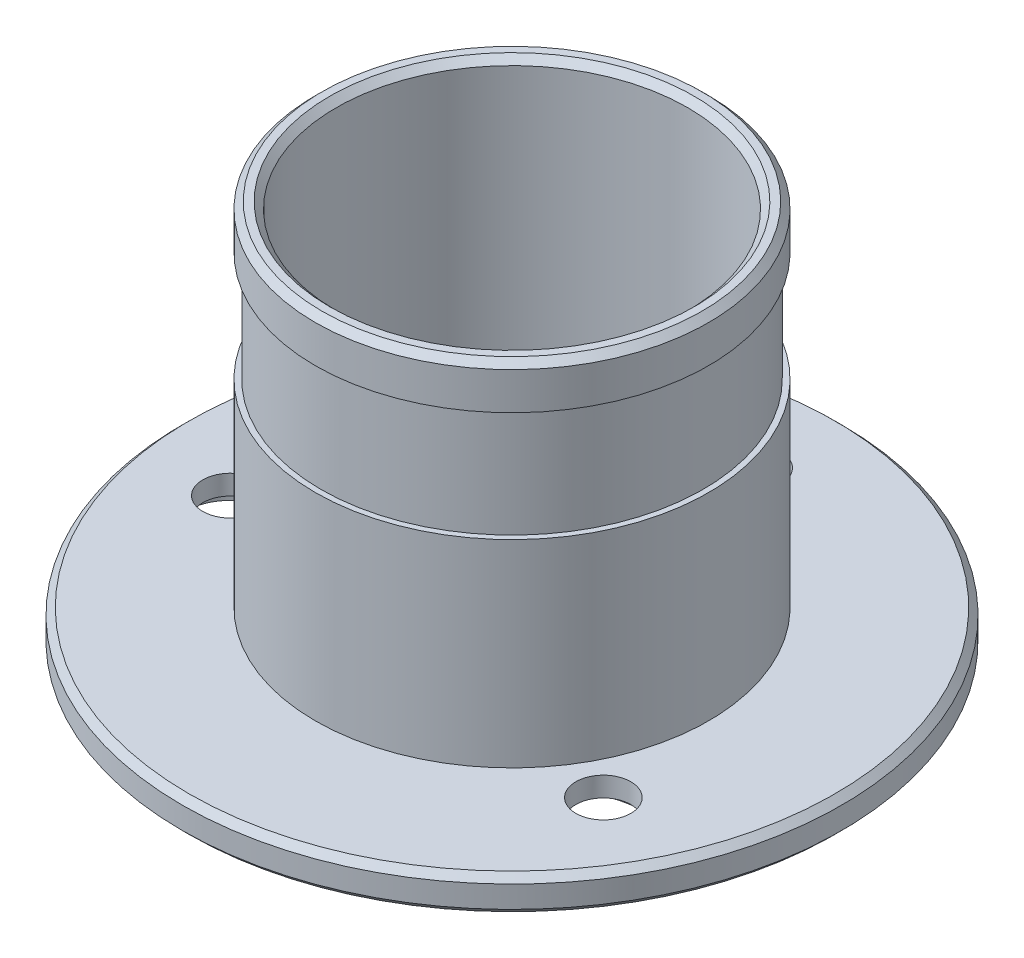
ISO-10303-21;
HEADER;
FILE_DESCRIPTION(('STEP AP214'),'2;1');
FILE_NAME('part.step','',(''),(''),'','','');
FILE_SCHEMA(('AUTOMOTIVE_DESIGN { 1 0 10303 214 1 1 1 1 }'));
ENDSEC;
DATA;
#1=APPLICATION_CONTEXT('core data for automotive mechanical design processes');
#2=APPLICATION_PROTOCOL_DEFINITION('international standard','automotive_design',2000,#1);
#3=PRODUCT_CONTEXT('',#1,'mechanical');
#4=PRODUCT('Part','Part','',(#3));
#5=PRODUCT_RELATED_PRODUCT_CATEGORY('part','',(#4));
#6=PRODUCT_DEFINITION_FORMATION('','',#4);
#7=PRODUCT_DEFINITION_CONTEXT('part definition',#1,'design');
#8=PRODUCT_DEFINITION('design','',#6,#7);
#9=PRODUCT_DEFINITION_SHAPE('','',#8);
#10=(LENGTH_UNIT() NAMED_UNIT(*) SI_UNIT(.MILLI.,.METRE.));
#11=(NAMED_UNIT(*) PLANE_ANGLE_UNIT() SI_UNIT($,.RADIAN.));
#12=(NAMED_UNIT(*) SI_UNIT($,.STERADIAN.) SOLID_ANGLE_UNIT());
#13=UNCERTAINTY_MEASURE_WITH_UNIT(LENGTH_MEASURE(1.E-05),#10,'distance_accuracy_value','');
#14=(GEOMETRIC_REPRESENTATION_CONTEXT(3) GLOBAL_UNCERTAINTY_ASSIGNED_CONTEXT((#13)) GLOBAL_UNIT_ASSIGNED_CONTEXT((#10,
#11,#12)) REPRESENTATION_CONTEXT('',''));
#15=CARTESIAN_POINT('',(0.,0.,0.));
#16=DIRECTION('',(0.,0.,1.));
#17=DIRECTION('',(1.,0.,0.));
#18=AXIS2_PLACEMENT_3D('',#15,#16,#17);
#19=CARTESIAN_POINT('',(0.,17.6,0.));
#20=DIRECTION('',(0.,-1.,0.));
#21=DIRECTION('',(0.,0.,-1.));
#22=AXIS2_PLACEMENT_3D('',#19,#20,#21);
#23=CYLINDRICAL_SURFACE('',#22,8.95);
#24=CARTESIAN_POINT('',(0.,1.6,0.));
#25=DIRECTION('',(0.,1.,0.));
#26=DIRECTION('',(0.,0.,1.));
#27=AXIS2_PLACEMENT_3D('',#24,#25,#26);
#28=CIRCLE('',#27,8.95);
#29=CARTESIAN_POINT('',(0.,1.6,8.95));
#30=VERTEX_POINT('',#29);
#31=EDGE_CURVE('E168',#30,#30,#28,.T.);
#32=ORIENTED_EDGE('',*,*,#31,.T.);
#33=EDGE_LOOP('',(#32));
#34=FACE_BOUND('',#33,.T.);
#35=CARTESIAN_POINT('',(0.,10.6,0.));
#36=DIRECTION('',(0.,1.,0.));
#37=DIRECTION('',(0.,0.,1.));
#38=AXIS2_PLACEMENT_3D('',#35,#36,#37);
#39=CIRCLE('',#38,8.95);
#40=CARTESIAN_POINT('',(0.,10.6,8.95));
#41=VERTEX_POINT('',#40);
#42=EDGE_CURVE('E86',#41,#41,#39,.T.);
#43=ORIENTED_EDGE('',*,*,#42,.F.);
#44=EDGE_LOOP('',(#43));
#45=FACE_BOUND('',#44,.T.);
#46=ADVANCED_FACE('F36',(#34,#45),#23,.T.);
#47=CARTESIAN_POINT('',(-10.8158039832035,1.6,2.00459078041355));
#48=DIRECTION('',(0.,1.,0.));
#49=DIRECTION('',(0.,0.,1.));
#50=AXIS2_PLACEMENT_3D('',#47,#48,#49);
#51=CYLINDRICAL_SURFACE('',#50,1.25);
#52=CARTESIAN_POINT('',(-10.8158039832035,1.6,2.00459078041355));
#53=DIRECTION('',(0.,1.,0.));
#54=DIRECTION('',(0.,0.,1.));
#55=AXIS2_PLACEMENT_3D('',#52,#53,#54);
#56=CIRCLE('',#55,1.24999999999999);
#57=CARTESIAN_POINT('',(-10.8158039832035,1.6,3.25459078041355));
#58=VERTEX_POINT('',#57);
#59=EDGE_CURVE('E197',#58,#58,#56,.T.);
#60=ORIENTED_EDGE('',*,*,#59,.T.);
#61=EDGE_LOOP('',(#60));
#62=FACE_BOUND('',#61,.T.);
#63=CARTESIAN_POINT('',(-10.8158039832035,0.7,2.00459078041355));
#64=DIRECTION('',(0.,-1.,0.));
#65=DIRECTION('',(0.,0.,-1.));
#66=AXIS2_PLACEMENT_3D('',#63,#64,#65);
#67=CIRCLE('',#66,1.25);
#68=CARTESIAN_POINT('',(-10.8158039832035,0.7,0.754590780413557));
#69=VERTEX_POINT('',#68);
#70=EDGE_CURVE('E191',#69,#69,#67,.F.);
#71=ORIENTED_EDGE('',*,*,#70,.F.);
#72=EDGE_LOOP('',(#71));
#73=FACE_BOUND('',#72,.T.);
#74=ADVANCED_FACE('F132',(#62,#73),#51,.F.);
#75=CARTESIAN_POINT('',(9.57391265533893,1.6,5.41665916113808));
#76=DIRECTION('',(0.,1.,0.));
#77=DIRECTION('',(0.,0.,1.));
#78=AXIS2_PLACEMENT_3D('',#75,#76,#77);
#79=CYLINDRICAL_SURFACE('',#78,1.25);
#80=CARTESIAN_POINT('',(9.57391265533893,1.6,5.41665916113808));
#81=DIRECTION('',(0.,1.,0.));
#82=DIRECTION('',(0.,0.,1.));
#83=AXIS2_PLACEMENT_3D('',#80,#81,#82);
#84=CIRCLE('',#83,1.24999999999999);
#85=CARTESIAN_POINT('',(9.57391265533893,1.6,6.66665916113807));
#86=VERTEX_POINT('',#85);
#87=EDGE_CURVE('E194',#86,#86,#84,.T.);
#88=ORIENTED_EDGE('',*,*,#87,.T.);
#89=EDGE_LOOP('',(#88));
#90=FACE_BOUND('',#89,.T.);
#91=CARTESIAN_POINT('',(9.57391265533893,0.7,5.41665916113808));
#92=DIRECTION('',(0.,-1.,0.));
#93=DIRECTION('',(0.,0.,-1.));
#94=AXIS2_PLACEMENT_3D('',#91,#92,#93);
#95=CIRCLE('',#94,1.25);
#96=CARTESIAN_POINT('',(9.57391265533893,0.7,4.16665916113808));
#97=VERTEX_POINT('',#96);
#98=EDGE_CURVE('E110',#97,#97,#95,.F.);
#99=ORIENTED_EDGE('',*,*,#98,.F.);
#100=EDGE_LOOP('',(#99));
#101=FACE_BOUND('',#100,.T.);
#102=ADVANCED_FACE('F128',(#90,#101),#79,.F.);
#103=CARTESIAN_POINT('',(0.,1.6,-11.));
#104=DIRECTION('',(0.,1.,0.));
#105=DIRECTION('',(0.,0.,1.));
#106=AXIS2_PLACEMENT_3D('',#103,#104,#105);
#107=CYLINDRICAL_SURFACE('',#106,1.25);
#108=CARTESIAN_POINT('',(0.,1.6,-11.));
#109=DIRECTION('',(0.,1.,0.));
#110=DIRECTION('',(0.,0.,1.));
#111=AXIS2_PLACEMENT_3D('',#108,#109,#110);
#112=CIRCLE('',#111,1.24999999999999);
#113=CARTESIAN_POINT('',(0.,1.6,-9.75000000000001));
#114=VERTEX_POINT('',#113);
#115=EDGE_CURVE('E101',#114,#114,#112,.T.);
#116=ORIENTED_EDGE('',*,*,#115,.T.);
#117=EDGE_LOOP('',(#116));
#118=FACE_BOUND('',#117,.T.);
#119=CARTESIAN_POINT('',(0.,0.7,-11.));
#120=DIRECTION('',(0.,-1.,0.));
#121=DIRECTION('',(0.,0.,-1.));
#122=AXIS2_PLACEMENT_3D('',#119,#120,#121);
#123=CIRCLE('',#122,1.25);
#124=CARTESIAN_POINT('',(0.,0.7,-12.25));
#125=VERTEX_POINT('',#124);
#126=EDGE_CURVE('E98',#125,#125,#123,.F.);
#127=ORIENTED_EDGE('',*,*,#126,.F.);
#128=EDGE_LOOP('',(#127));
#129=FACE_BOUND('',#128,.T.);
#130=ADVANCED_FACE('F124',(#118,#129),#107,.F.);
#131=CARTESIAN_POINT('',(0.,1.6,0.));
#132=DIRECTION('',(0.,-1.,0.));
#133=DIRECTION('',(0.,0.,-1.));
#134=AXIS2_PLACEMENT_3D('',#131,#132,#133);
#135=CYLINDRICAL_SURFACE('',#134,15.);
#136=CARTESIAN_POINT('',(0.,0.299999999999993,0.));
#137=DIRECTION('',(0.,1.,0.));
#138=DIRECTION('',(0.,0.,1.));
#139=AXIS2_PLACEMENT_3D('',#136,#137,#138);
#140=CIRCLE('',#139,15.);
#141=CARTESIAN_POINT('',(0.,0.299999999999993,15.));
#142=VERTEX_POINT('',#141);
#143=EDGE_CURVE('E406',#142,#142,#140,.T.);
#144=ORIENTED_EDGE('',*,*,#143,.T.);
#145=EDGE_LOOP('',(#144));
#146=FACE_BOUND('',#145,.T.);
#147=CARTESIAN_POINT('',(0.,1.3,0.));
#148=DIRECTION('',(0.,1.,0.));
#149=DIRECTION('',(0.,0.,1.));
#150=AXIS2_PLACEMENT_3D('',#147,#148,#149);
#151=CIRCLE('',#150,15.);
#152=CARTESIAN_POINT('',(0.,1.3,15.));
#153=VERTEX_POINT('',#152);
#154=EDGE_CURVE('E408',#153,#153,#151,.F.);
#155=ORIENTED_EDGE('',*,*,#154,.T.);
#156=EDGE_LOOP('',(#155));
#157=FACE_BOUND('',#156,.T.);
#158=ADVANCED_FACE('F127',(#146,#157),#135,.T.);
#159=CARTESIAN_POINT('',(0.,1.6,0.));
#160=DIRECTION('',(0.,1.,0.));
#161=DIRECTION('',(0.,0.,1.));
#162=AXIS2_PLACEMENT_3D('',#159,#160,#161);
#163=PLANE('',#162);
#164=CARTESIAN_POINT('',(0.,1.6,0.));
#165=DIRECTION('',(0.,1.,0.));
#166=DIRECTION('',(0.,0.,1.));
#167=AXIS2_PLACEMENT_3D('',#164,#165,#166);
#168=CIRCLE('',#167,14.7);
#169=CARTESIAN_POINT('',(0.,1.6,14.7));
#170=VERTEX_POINT('',#169);
#171=EDGE_CURVE('E392',#170,#170,#168,.T.);
#172=ORIENTED_EDGE('',*,*,#171,.T.);
#173=EDGE_LOOP('',(#172));
#174=FACE_BOUND('',#173,.T.);
#175=ORIENTED_EDGE('',*,*,#115,.F.);
#176=EDGE_LOOP('',(#175));
#177=FACE_BOUND('',#176,.T.);
#178=ORIENTED_EDGE('',*,*,#87,.F.);
#179=EDGE_LOOP('',(#178));
#180=FACE_BOUND('',#179,.T.);
#181=ORIENTED_EDGE('',*,*,#59,.F.);
#182=EDGE_LOOP('',(#181));
#183=FACE_BOUND('',#182,.T.);
#184=ORIENTED_EDGE('',*,*,#31,.F.);
#185=EDGE_LOOP('',(#184));
#186=FACE_BOUND('',#185,.T.);
#187=ADVANCED_FACE('F149',(#174,#177,#180,#183,#186),#163,.T.);
#188=CARTESIAN_POINT('',(0.,0.,0.));
#189=DIRECTION('',(0.,1.,0.));
#190=DIRECTION('',(0.,0.,1.));
#191=AXIS2_PLACEMENT_3D('',#188,#189,#190);
#192=PLANE('',#191);
#193=CARTESIAN_POINT('',(0.,0.,0.));
#194=DIRECTION('',(0.,1.,0.));
#195=DIRECTION('',(0.,0.,1.));
#196=AXIS2_PLACEMENT_3D('',#193,#194,#195);
#197=CIRCLE('',#196,14.7);
#198=CARTESIAN_POINT('',(0.,0.,14.7));
#199=VERTEX_POINT('',#198);
#200=EDGE_CURVE('E397',#199,#199,#197,.F.);
#201=ORIENTED_EDGE('',*,*,#200,.T.);
#202=EDGE_LOOP('',(#201));
#203=FACE_BOUND('',#202,.T.);
#204=CARTESIAN_POINT('',(0.,0.,0.));
#205=DIRECTION('',(0.,1.,0.));
#206=DIRECTION('',(0.,0.,1.));
#207=AXIS2_PLACEMENT_3D('',#204,#205,#206);
#208=CIRCLE('',#207,10.);
#209=CARTESIAN_POINT('',(-1.64580609002106,0.,-9.86363636363636));
#210=VERTEX_POINT('',#209);
#211=CARTESIAN_POINT('',(-9.9983931986449,0.,0.179258041078813));
#212=VERTEX_POINT('',#211);
#213=EDGE_CURVE('E92',#210,#212,#208,.T.);
#214=ORIENTED_EDGE('',*,*,#213,.T.);
#215=CARTESIAN_POINT('',(-10.8158039832035,0.,2.00459078041355));
#216=DIRECTION('',(0.,-1.,0.));
#217=DIRECTION('',(0.,0.,-1.));
#218=AXIS2_PLACEMENT_3D('',#215,#216,#217);
#219=CIRCLE('',#218,2.);
#220=CARTESIAN_POINT('',(-9.39854452329859,0.,3.41575187090252));
#221=VERTEX_POINT('',#220);
#222=EDGE_CURVE('E50',#221,#212,#219,.T.);
#223=ORIENTED_EDGE('',*,*,#222,.F.);
#224=CARTESIAN_POINT('',(7.77443839768273,0.,6.28952363861019));
#225=VERTEX_POINT('',#224);
#226=EDGE_CURVE('E84',#221,#225,#208,.T.);
#227=ORIENTED_EDGE('',*,*,#226,.T.);
#228=CARTESIAN_POINT('',(9.57391265533893,0.,5.41665916113808));
#229=DIRECTION('',(0.,-1.,0.));
#230=DIRECTION('',(0.,0.,-1.));
#231=AXIS2_PLACEMENT_3D('',#228,#229,#230);
#232=CIRCLE('',#231,2.);
#233=CARTESIAN_POINT('',(9.39530578585899,0.,3.42465022888537));
#234=VERTEX_POINT('',#233);
#235=EDGE_CURVE('E57',#234,#225,#232,.T.);
#236=ORIENTED_EDGE('',*,*,#235,.F.);
#237=CARTESIAN_POINT('',(1.64580609002106,0.,-9.86363636363637));
#238=VERTEX_POINT('',#237);
#239=EDGE_CURVE('E82',#234,#238,#208,.T.);
#240=ORIENTED_EDGE('',*,*,#239,.T.);
#241=CARTESIAN_POINT('',(0.,0.,-11.));
#242=DIRECTION('',(0.,-1.,0.));
#243=DIRECTION('',(0.,0.,-1.));
#244=AXIS2_PLACEMENT_3D('',#241,#242,#243);
#245=CIRCLE('',#244,2.);
#246=EDGE_CURVE('E189',#210,#238,#245,.T.);
#247=ORIENTED_EDGE('',*,*,#246,.F.);
#248=EDGE_LOOP('',(#214,#223,#227,#236,#240,#247));
#249=FACE_BOUND('',#248,.T.);
#250=ADVANCED_FACE('F80',(#203,#249),#192,.F.);
#251=CARTESIAN_POINT('',(0.,17.3,0.));
#252=DIRECTION('',(0.,1.,0.));
#253=DIRECTION('',(0.,0.,1.));
#254=AXIS2_PLACEMENT_3D('',#251,#252,#253);
#255=CIRCLE('',#254,8.95);
#256=CARTESIAN_POINT('',(0.,17.3,8.95));
#257=VERTEX_POINT('',#256);
#258=EDGE_CURVE('E11',#257,#257,#255,.F.);
#259=ORIENTED_EDGE('',*,*,#258,.T.);
#260=EDGE_LOOP('',(#259));
#261=FACE_BOUND('',#260,.T.);
#262=CARTESIAN_POINT('',(0.,15.6,0.));
#263=DIRECTION('',(0.,1.,0.));
#264=DIRECTION('',(0.,0.,1.));
#265=AXIS2_PLACEMENT_3D('',#262,#263,#264);
#266=CIRCLE('',#265,8.95);
#267=CARTESIAN_POINT('',(0.,15.6,8.95));
#268=VERTEX_POINT('',#267);
#269=EDGE_CURVE('E172',#268,#268,#266,.T.);
#270=ORIENTED_EDGE('',*,*,#269,.T.);
#271=EDGE_LOOP('',(#270));
#272=FACE_BOUND('',#271,.T.);
#273=ADVANCED_FACE('F144',(#261,#272),#23,.T.);
#274=CARTESIAN_POINT('',(0.,17.6,0.));
#275=DIRECTION('',(0.,1.,0.));
#276=DIRECTION('',(0.,0.,1.));
#277=AXIS2_PLACEMENT_3D('',#274,#275,#276);
#278=PLANE('',#277);
#279=CARTESIAN_POINT('',(0.,17.6,0.));
#280=DIRECTION('',(0.,1.,0.));
#281=DIRECTION('',(0.,0.,1.));
#282=AXIS2_PLACEMENT_3D('',#279,#280,#281);
#283=CIRCLE('',#282,8.3);
#284=CARTESIAN_POINT('',(0.,17.6,8.3));
#285=VERTEX_POINT('',#284);
#286=EDGE_CURVE('E391',#285,#285,#283,.F.);
#287=ORIENTED_EDGE('',*,*,#286,.T.);
#288=EDGE_LOOP('',(#287));
#289=FACE_BOUND('',#288,.T.);
#290=CARTESIAN_POINT('',(0.,17.6,0.));
#291=DIRECTION('',(0.,1.,0.));
#292=DIRECTION('',(0.,0.,1.));
#293=AXIS2_PLACEMENT_3D('',#290,#291,#292);
#294=CIRCLE('',#293,8.65);
#295=CARTESIAN_POINT('',(0.,17.6,8.65));
#296=VERTEX_POINT('',#295);
#297=EDGE_CURVE('E389',#296,#296,#294,.T.);
#298=ORIENTED_EDGE('',*,*,#297,.T.);
#299=EDGE_LOOP('',(#298));
#300=FACE_BOUND('',#299,.T.);
#301=ADVANCED_FACE('F140',(#289,#300),#278,.T.);
#302=CARTESIAN_POINT('',(0.,17.6,0.));
#303=DIRECTION('',(0.,-1.,0.));
#304=DIRECTION('',(0.,0.,-1.));
#305=AXIS2_PLACEMENT_3D('',#302,#303,#304);
#306=CYLINDRICAL_SURFACE('',#305,8.);
#307=CARTESIAN_POINT('',(0.,17.3,0.));
#308=DIRECTION('',(0.,1.,0.));
#309=DIRECTION('',(0.,0.,1.));
#310=AXIS2_PLACEMENT_3D('',#307,#308,#309);
#311=CIRCLE('',#310,8.);
#312=CARTESIAN_POINT('',(0.,17.3,8.));
#313=VERTEX_POINT('',#312);
#314=EDGE_CURVE('E44',#313,#313,#311,.T.);
#315=ORIENTED_EDGE('',*,*,#314,.T.);
#316=EDGE_LOOP('',(#315));
#317=FACE_BOUND('',#316,.T.);
#318=CARTESIAN_POINT('',(0.,2.,0.));
#319=DIRECTION('',(0.,1.,0.));
#320=DIRECTION('',(0.,0.,1.));
#321=AXIS2_PLACEMENT_3D('',#318,#319,#320);
#322=CIRCLE('',#321,8.);
#323=CARTESIAN_POINT('',(0.,2.,8.));
#324=VERTEX_POINT('',#323);
#325=EDGE_CURVE('E94',#324,#324,#322,.F.);
#326=ORIENTED_EDGE('',*,*,#325,.T.);
#327=EDGE_LOOP('',(#326));
#328=FACE_BOUND('',#327,.T.);
#329=ADVANCED_FACE('F137',(#317,#328),#306,.F.);
#330=CARTESIAN_POINT('',(0.,2.,0.));
#331=DIRECTION('',(0.,1.,0.));
#332=DIRECTION('',(0.,0.,1.));
#333=AXIS2_PLACEMENT_3D('',#330,#331,#332);
#334=TOROIDAL_SURFACE('',#333,10.,2.);
#335=CARTESIAN_POINT('',(-10.0002,8.02871343814136E-07,0.178450002000629));
#336=CARTESIAN_POINT('',(-9.95175655283306,-5.41635682755072E-05,0.200073787911794));
#337=CARTESIAN_POINT('',(-9.90421512538996,0.00164634955110516,0.223630471712747));
#338=CARTESIAN_POINT('',(-9.81136999973981,0.00803475739235196,0.274303943456465));
#339=CARTESIAN_POINT('',(-9.76606289711438,0.0127179457406307,0.301415069407518));
#340=CARTESIAN_POINT('',(-9.67829235556666,0.0245072981426061,0.358747880782084));
#341=CARTESIAN_POINT('',(-9.63581030294693,0.0315952165107423,0.388944980012131));
#342=CARTESIAN_POINT('',(-9.55354093988836,0.0476401050901379,0.452369459736765));
#343=CARTESIAN_POINT('',(-9.51375469154369,0.056597806352712,0.485598022609756));
#344=CARTESIAN_POINT('',(-9.39915583762231,0.0853022481486939,0.5890837160956));
#345=CARTESIAN_POINT('',(-9.32853684992701,0.106970488670622,0.663513800750266));
#346=CARTESIAN_POINT('',(-9.19932458007804,0.150780685193722,0.822424299656711));
#347=CARTESIAN_POINT('',(-9.14076861636084,0.172923883994918,0.906934662009231));
#348=CARTESIAN_POINT('',(-9.0598294027629,0.20391401916117,1.04549478597275));
#349=CARTESIAN_POINT('',(-9.03287498916442,0.214321004054683,1.09656202457442));
#350=CARTESIAN_POINT('',(-8.98335970854738,0.23288219942919,1.20116514566655));
#351=CARTESIAN_POINT('',(-8.96079645136246,0.241037636476084,1.25469966544367));
#352=CARTESIAN_POINT('',(-8.92037900692208,0.254348994446374,1.36370655941676));
#353=CARTESIAN_POINT('',(-8.9025112301413,0.259513624686197,1.41917280316776));
#354=CARTESIAN_POINT('',(-8.87165203582803,0.266372569324552,1.53165135860577));
#355=CARTESIAN_POINT('',(-8.85865939267074,0.268067756430638,1.58866327783496));
#356=CARTESIAN_POINT('',(-8.83925702111371,0.267835825520736,1.69516051663332));
#357=CARTESIAN_POINT('',(-8.8321613170127,0.266403477179875,1.74452345482672));
#358=CARTESIAN_POINT('',(-8.82167915896617,0.261007279479681,1.84350992016796));
#359=CARTESIAN_POINT('',(-8.81829397786852,0.257042562160975,1.89313353087446));
#360=CARTESIAN_POINT('',(-8.81369504472958,0.241729876948254,2.04191339173264));
#361=CARTESIAN_POINT('',(-8.81804503465611,0.226963813813461,2.14093899957294));
#362=CARTESIAN_POINT('',(-8.84074227402581,0.192452980809001,2.33375355859857));
#363=CARTESIAN_POINT('',(-8.85873828735643,0.17284133878384,2.42761150582449));
#364=CARTESIAN_POINT('',(-8.90777955545328,0.132430771377901,2.61165663481893));
#365=CARTESIAN_POINT('',(-8.9388387500397,0.111630598256645,2.70183978208429));
#366=CARTESIAN_POINT('',(-9.0211878196832,0.0689002348758596,2.89473831723904));
#367=CARTESIAN_POINT('',(-9.07525068034403,0.0475484429214441,2.99644287685761));
#368=CARTESIAN_POINT('',(-9.16941518456613,0.0232291268322022,3.14157471263807));
#369=CARTESIAN_POINT('',(-9.202960903903,0.0164089619499197,3.18869193499434));
#370=CARTESIAN_POINT('',(-9.27419678477926,0.00604431815246742,3.28005126312658));
#371=CARTESIAN_POINT('',(-9.31188480684799,0.00249815705129509,3.324294834511));
#372=CARTESIAN_POINT('',(-9.4081920740971,-0.00132294969571857,3.42780618161867));
#373=CARTESIAN_POINT('',(-9.46882573506844,0.000474005248986617,3.48531871318394));
#374=CARTESIAN_POINT('',(-9.59616693090646,0.0136779614062133,3.59184034481225));
#375=CARTESIAN_POINT('',(-9.66286812140527,0.0250750252194257,3.6408581747913));
#376=CARTESIAN_POINT('',(-9.77514964062881,0.0521402564352119,3.71332219199655));
#377=CARTESIAN_POINT('',(-9.81966551202949,0.0647828866737897,3.73961295212852));
#378=CARTESIAN_POINT('',(-9.9094966711039,0.09420553440937,3.78819050318382));
#379=CARTESIAN_POINT('',(-9.95481180223008,0.110984749865956,3.81047806883819));
#380=CARTESIAN_POINT('',(-10.0002,0.12981405041566,3.83073155882648));
#381=B_SPLINE_CURVE_WITH_KNOTS('',3,(#335,#336,#337,#338,#339,#340,#341,#342,#343,#344,#345,
#346,#347,#348,#349,#350,#351,#352,#353,#354,#355,#356,#357,#358,#359,#360,#361,#362,#363,#364,
#365,#366,#367,#368,#369,#370,#371,#372,#373,#374,#375,#376,#377,#378,#379,#380),.UNSPECIFIED.,
.F.,.F.,(4,2,2,2,2,2,2,2,2,2,2,2,2,2,2,2,2,2,2,2,2,2,4),(0.,0.15902588495227,0.317801461994482,
0.475398327605014,0.633056926546343,0.946346672115495,1.26059152639378,1.43639719608472,
1.61210690305319,1.78730233133886,1.96245368535432,2.11191821336749,2.26143399726154,
2.56058478019611,2.85228655471634,3.14430039936457,3.4935831299027,3.6680433018592,
3.84241378606119,4.09202798199913,4.34138411086534,4.50075475840182,4.66009452991284),.UNSPECIFIED.);
#382=EDGE_CURVE('E75',#212,#221,#381,.T.);
#383=ORIENTED_EDGE('',*,*,#382,.F.);
#384=ORIENTED_EDGE('',*,*,#213,.F.);
#385=CARTESIAN_POINT('',(1.73216626222773,0.00556606918945767,-10.0002));
#386=CARTESIAN_POINT('',(1.70705596950393,0.00202547902098039,-9.95666918010905));
#387=CARTESIAN_POINT('',(1.68023472544801,0.000240492864602129,-9.91401576926436));
#388=CARTESIAN_POINT('',(1.62348730807238,-0.000193482640913605,-9.83089647789337));
#389=CARTESIAN_POINT('',(1.59356572665659,0.00115295174974964,-9.79042749349801));
#390=CARTESIAN_POINT('',(1.53117024449527,0.00657148944891971,-9.71236901491026));
#391=CARTESIAN_POINT('',(1.49872456460112,0.0106164589265417,-9.67475496673333));
#392=CARTESIAN_POINT('',(1.43129975810537,0.0209631778310298,-9.60220308170686));
#393=CARTESIAN_POINT('',(1.39631978187626,0.0272656869212178,-9.56726615051837));
#394=CARTESIAN_POINT('',(1.28836169550636,0.0487861018140975,-9.46712377018182));
#395=CARTESIAN_POINT('',(1.21197315244876,0.066661828280697,-9.40609934637752));
#396=CARTESIAN_POINT('',(1.05153434691127,0.105680640496303,-9.29594155618274));
#397=CARTESIAN_POINT('',(0.967455991541167,0.126835920087793,-9.24685439906336));
#398=CARTESIAN_POINT('',(0.78051526591556,0.171182954797858,-9.1552609191298));
#399=CARTESIAN_POINT('',(0.676672056572742,0.194244368519742,-9.11464222546955));
#400=CARTESIAN_POINT('',(0.516186004760411,0.223264757654924,-9.06695426712702));
#401=CARTESIAN_POINT('',(0.461941200482462,0.232005656900522,-9.05326964349725));
#402=CARTESIAN_POINT('',(0.352171834866163,0.246950902891493,-9.03045406736736));
#403=CARTESIAN_POINT('',(0.296648161593543,0.253156956921107,-9.02132004900195));
#404=CARTESIAN_POINT('',(0.187187360458964,0.262283670183095,-9.00804913751075));
#405=CARTESIAN_POINT('',(0.133285264281589,0.265334633612435,-9.00371348046536));
#406=CARTESIAN_POINT('',(0.0252191720402137,0.268349887028038,-8.99942821034744));
#407=CARTESIAN_POINT('',(-0.0289448138556509,0.268314295905794,-8.99947842833467));
#408=CARTESIAN_POINT('',(-0.137015089464536,0.265157295560541,-9.00396589076748));
#409=CARTESIAN_POINT('',(-0.190921300076879,0.262034993443095,-9.00840440461763));
#410=CARTESIAN_POINT('',(-0.297950223943025,0.252981109905922,-9.02158241742881));
#411=CARTESIAN_POINT('',(-0.351072926111271,0.247049488777471,-9.03032197718367));
#412=CARTESIAN_POINT('',(-0.49444889748858,0.227663382099338,-9.05986819149799));
#413=CARTESIAN_POINT('',(-0.583557874242318,0.211876502778277,-9.08482751595515));
#414=CARTESIAN_POINT('',(-0.756884112682924,0.176571881436012,-9.14645713730162));
#415=CARTESIAN_POINT('',(-0.841093804133856,0.15704855567661,-9.18314501703676));
#416=CARTESIAN_POINT('',(-1.01888390431818,0.114158811480118,-9.27555945192192));
#417=CARTESIAN_POINT('',(-1.11128460778061,0.090754462695571,-9.3335602298065));
#418=CARTESIAN_POINT('',(-1.2859980898944,0.0494607995166572,-9.46440355091746));
#419=CARTESIAN_POINT('',(-1.36834147691581,0.0315544871260843,-9.53719916966554));
#420=CARTESIAN_POINT('',(-1.49951123879346,0.0100169702751413,-9.67418718851571));
#421=CARTESIAN_POINT('',(-1.55128669967205,0.00379946822819745,-9.73513285210472));
#422=CARTESIAN_POINT('',(-1.62341260261407,6.08186531655146E-07,-9.83117550643299));
#423=CARTESIAN_POINT('',(-1.6465936198189,-0.000336969473546896,-9.86406749238547));
#424=CARTESIAN_POINT('',(-1.69093434855289,0.00103341263054042,-9.93118602170716));
#425=CARTESIAN_POINT('',(-1.71209224743963,0.00274318854627713,-9.96541372388238));
#426=CARTESIAN_POINT('',(-1.73216626222773,0.00556606918945779,-10.0002));
#427=B_SPLINE_CURVE_WITH_KNOTS('',3,(#385,#386,#387,#388,#389,#390,#391,#392,#393,#394,#395,
#396,#397,#398,#399,#400,#401,#402,#403,#404,#405,#406,#407,#408,#409,#410,#411,#412,#413,#414,
#415,#416,#417,#418,#419,#420,#421,#422,#423,#424,#425,#426),.UNSPECIFIED.,.F.,.F.,(4,2,2,2,2,2,
2,2,2,2,2,2,2,2,2,2,2,2,2,2,4),(0.,0.151027292620313,0.301834012564506,0.451146773716796,
0.600509825968807,0.897377453023306,1.19537659035296,1.53515721428152,1.704823332178,
1.87437498633731,2.03660465300063,2.19882807071599,2.36109842861574,2.52337108021767,
2.80386355630666,3.0847785198742,3.41806297890693,3.75030641617098,3.99005604227586,
4.11066620540493,4.23138343782949),.UNSPECIFIED.);
#428=EDGE_CURVE('E76',#238,#210,#427,.T.);
#429=ORIENTED_EDGE('',*,*,#428,.F.);
#430=ORIENTED_EDGE('',*,*,#239,.F.);
#431=CARTESIAN_POINT('',(8.909380197824,0.7002,7.30303044296708));
#432=CARTESIAN_POINT('',(8.84754678218232,0.628092539337089,7.28129675955265));
#433=CARTESIAN_POINT('',(8.78231397104917,0.560020454916646,7.25484934763422));
#434=CARTESIAN_POINT('',(8.64747986785416,0.433029218268382,7.19072139219902));
#435=CARTESIAN_POINT('',(8.577847691096,0.37418799066388,7.15295231271843));
#436=CARTESIAN_POINT('',(8.43734746781996,0.267657854792765,7.06442995850649));
#437=CARTESIAN_POINT('',(8.36647471941458,0.220032340859535,7.01360611860893));
#438=CARTESIAN_POINT('',(8.22806587507016,0.13834874914769,6.89879283346476));
#439=CARTESIAN_POINT('',(8.16051722826784,0.104235549027094,6.83485852715946));
#440=CARTESIAN_POINT('',(8.03984026013041,0.0534159790745295,6.70263120169964));
#441=CARTESIAN_POINT('',(7.98594386389388,0.0351927035482615,6.63561930739283));
#442=CARTESIAN_POINT('',(7.88646456961135,0.00988859910048022,6.49370517311384));
#443=CARTESIAN_POINT('',(7.84088834970223,0.002816686282486,6.41879667038296));
#444=CARTESIAN_POINT('',(7.76254045337692,-0.00129143679353432,6.26851286052434));
#445=CARTESIAN_POINT('',(7.72913159185101,0.00105328379212196,6.19348062003655));
#446=CARTESIAN_POINT('',(7.67191464474875,0.0126841029804549,6.04042563914012));
#447=CARTESIAN_POINT('',(7.64810576384162,0.0219696263756212,5.96240314705193));
#448=CARTESIAN_POINT('',(7.60780675008103,0.046962542196859,5.79456302892079));
#449=CARTESIAN_POINT('',(7.59266336433067,0.0633457532707636,5.70452619533834));
#450=CARTESIAN_POINT('',(7.57471060775574,0.0992188347884196,5.52376963152849));
#451=CARTESIAN_POINT('',(7.57192254419201,0.118714012027662,5.43304899164039));
#452=CARTESIAN_POINT('',(7.57938024360327,0.16168001160226,5.23239779479871));
#453=CARTESIAN_POINT('',(7.59256125640533,0.185103162264446,5.12253637665976));
#454=CARTESIAN_POINT('',(7.62600150926653,0.215379541534752,4.95981050215119));
#455=CARTESIAN_POINT('',(7.63942327200746,0.22466089085144,4.90592103771994));
#456=CARTESIAN_POINT('',(7.67082022514995,0.240902014967061,4.79913941039311));
#457=CARTESIAN_POINT('',(7.68879243206976,0.24786330400458,4.74624661835238));
#458=CARTESIAN_POINT('',(7.72877711775883,0.258750161097391,4.64305179159509));
#459=CARTESIAN_POINT('',(7.75069064416625,0.262739917173381,4.59271829003986));
#460=CARTESIAN_POINT('',(7.79865596922889,0.26758310129598,4.49390284460523));
#461=CARTESIAN_POINT('',(7.82470758604565,0.268436667115199,4.4454208194832));
#462=CARTESIAN_POINT('',(7.88069163979357,0.266927204276569,4.35081560685483));
#463=CARTESIAN_POINT('',(7.91062337121748,0.264564759634155,4.30469199264793));
#464=CARTESIAN_POINT('',(7.97403689565181,0.256845526387114,4.21524052158083));
#465=CARTESIAN_POINT('',(8.00751867735624,0.251488747318442,4.17191265581759));
#466=CARTESIAN_POINT('',(8.10226879601744,0.233578067267141,4.05914259052976));
#467=CARTESIAN_POINT('',(8.16659775524908,0.218610750992659,3.99262185004929));
#468=CARTESIAN_POINT('',(8.30316394205372,0.184467656464277,3.86950557296955));
#469=CARTESIAN_POINT('',(8.37541162378339,0.165286280517903,3.81292341978599));
#470=CARTESIAN_POINT('',(8.53988918747293,0.122884583526342,3.7013465143652));
#471=CARTESIAN_POINT('',(8.63341783062279,0.0995374465637525,3.64830218000663));
#472=CARTESIAN_POINT('',(8.82860113936604,0.057443711691499,3.55761251827857));
#473=CARTESIAN_POINT('',(8.93024621169319,0.0386917861077646,3.51994932395487));
#474=CARTESIAN_POINT('',(9.11963750044462,0.0136231880360293,3.46694810421825));
#475=CARTESIAN_POINT('',(9.20634443873813,0.00561847753591753,3.44872449208186));
#476=CARTESIAN_POINT('',(9.38169845710171,-0.00147120644090451,3.42395704515067));
#477=CARTESIAN_POINT('',(9.47034158258307,-0.000572923340632473,3.4173913133759));
#478=CARTESIAN_POINT('',(9.63381510162267,0.0110475694637397,3.4161437864719));
#479=CARTESIAN_POINT('',(9.70873507480232,0.020285629923773,3.41983661639574));
#480=CARTESIAN_POINT('',(9.81947039825736,0.0404208143721811,3.43144000609227));
#481=CARTESIAN_POINT('',(9.85620733683839,0.0482092006418376,3.43634051924018));
#482=CARTESIAN_POINT('',(9.92886725421481,0.0659007868925172,3.44806486956965));
#483=CARTESIAN_POINT('',(9.96479000012767,0.0758045837047038,3.45488924971541));
#484=CARTESIAN_POINT('',(10.0002,0.0867695412806386,3.46261742673684));
#485=B_SPLINE_CURVE_WITH_KNOTS('',3,(#431,#432,#433,#434,#435,#436,#437,#438,#439,#440,#441,
#442,#443,#444,#445,#446,#447,#448,#449,#450,#451,#452,#453,#454,#455,#456,#457,#458,#459,#460,
#461,#462,#463,#464,#465,#466,#467,#468,#469,#470,#471,#472,#473,#474,#475,#476,#477,#478,#479,
#480,#481,#482,#483,#484),.UNSPECIFIED.,.F.,.F.,(4,2,2,2,2,2,2,2,2,2,2,2,2,2,2,2,2,2,2,2,2,2,2,
2,2,2,4),(0.,0.292434206195331,0.587217721574371,0.883629456402544,1.17881923425121,
1.44109089500613,1.70357214967017,1.94908920226662,2.19458591030045,2.47186876816758,
2.74962962609368,3.08718905649631,3.25591694990764,3.42453450268256,3.58939477815633,
3.75424781124358,3.91907091163153,4.08389348711582,4.36395257969575,4.6443859590347,
4.9730999306101,5.301430969686,5.56723763060883,5.83254449699027,6.05830903607323,
6.17182073268892,6.2853644973191),.UNSPECIFIED.);
#486=EDGE_CURVE('E68',#225,#234,#485,.T.);
#487=ORIENTED_EDGE('',*,*,#486,.F.);
#488=ORIENTED_EDGE('',*,*,#226,.F.);
#489=EDGE_LOOP('',(#383,#384,#429,#430,#487,#488));
#490=FACE_BOUND('',#489,.T.);
#491=ORIENTED_EDGE('',*,*,#325,.F.);
#492=EDGE_LOOP('',(#491));
#493=FACE_BOUND('',#492,.T.);
#494=ADVANCED_FACE('F89',(#490,#493),#334,.T.);
#495=CARTESIAN_POINT('',(0.,0.7,-11.));
#496=DIRECTION('',(0.,-1.,0.));
#497=DIRECTION('',(0.,0.,-1.));
#498=AXIS2_PLACEMENT_3D('',#495,#496,#497);
#499=PLANE('',#498);
#500=CARTESIAN_POINT('',(0.,0.7,-11.));
#501=DIRECTION('',(0.,-1.,0.));
#502=DIRECTION('',(0.,0.,-1.));
#503=AXIS2_PLACEMENT_3D('',#500,#501,#502);
#504=CIRCLE('',#503,2.);
#505=CARTESIAN_POINT('',(0.,0.7,-13.));
#506=VERTEX_POINT('',#505);
#507=EDGE_CURVE('E102',#506,#506,#504,.T.);
#508=ORIENTED_EDGE('',*,*,#507,.T.);
#509=EDGE_LOOP('',(#508));
#510=FACE_BOUND('',#509,.T.);
#511=ORIENTED_EDGE('',*,*,#126,.T.);
#512=EDGE_LOOP('',(#511));
#513=FACE_BOUND('',#512,.T.);
#514=ADVANCED_FACE('F121',(#510,#513),#499,.T.);
#515=CARTESIAN_POINT('',(0.,0.7,-11.));
#516=DIRECTION('',(0.,-1.,0.));
#517=DIRECTION('',(0.,0.,-1.));
#518=AXIS2_PLACEMENT_3D('',#515,#516,#517);
#519=CYLINDRICAL_SURFACE('',#518,2.);
#520=ORIENTED_EDGE('',*,*,#428,.T.);
#521=ORIENTED_EDGE('',*,*,#246,.T.);
#522=EDGE_LOOP('',(#520,#521));
#523=FACE_BOUND('',#522,.T.);
#524=ORIENTED_EDGE('',*,*,#507,.F.);
#525=EDGE_LOOP('',(#524));
#526=FACE_BOUND('',#525,.T.);
#527=ADVANCED_FACE('F115',(#523,#526),#519,.F.);
#528=CARTESIAN_POINT('',(9.57391265533893,0.7,5.41665916113808));
#529=DIRECTION('',(0.,-1.,0.));
#530=DIRECTION('',(0.,0.,-1.));
#531=AXIS2_PLACEMENT_3D('',#528,#529,#530);
#532=PLANE('',#531);
#533=CARTESIAN_POINT('',(9.57391265533893,0.7,5.41665916113808));
#534=DIRECTION('',(0.,-1.,0.));
#535=DIRECTION('',(0.,0.,-1.));
#536=AXIS2_PLACEMENT_3D('',#533,#534,#535);
#537=CIRCLE('',#536,2.);
#538=CARTESIAN_POINT('',(9.57391265533893,0.7,3.41665916113808));
#539=VERTEX_POINT('',#538);
#540=EDGE_CURVE('E85',#539,#539,#537,.T.);
#541=ORIENTED_EDGE('',*,*,#540,.T.);
#542=EDGE_LOOP('',(#541));
#543=FACE_BOUND('',#542,.T.);
#544=ORIENTED_EDGE('',*,*,#98,.T.);
#545=EDGE_LOOP('',(#544));
#546=FACE_BOUND('',#545,.T.);
#547=ADVANCED_FACE('F120',(#543,#546),#532,.T.);
#548=CARTESIAN_POINT('',(9.57391265533893,0.7,5.41665916113808));
#549=DIRECTION('',(0.,-1.,0.));
#550=DIRECTION('',(0.,0.,-1.));
#551=AXIS2_PLACEMENT_3D('',#548,#549,#550);
#552=CYLINDRICAL_SURFACE('',#551,2.);
#553=ORIENTED_EDGE('',*,*,#486,.T.);
#554=ORIENTED_EDGE('',*,*,#235,.T.);
#555=EDGE_LOOP('',(#553,#554));
#556=FACE_BOUND('',#555,.T.);
#557=ORIENTED_EDGE('',*,*,#540,.F.);
#558=EDGE_LOOP('',(#557));
#559=FACE_BOUND('',#558,.T.);
#560=ADVANCED_FACE('F69',(#556,#559),#552,.F.);
#561=CARTESIAN_POINT('',(-10.8158039832035,0.7,2.00459078041355));
#562=DIRECTION('',(0.,-1.,0.));
#563=DIRECTION('',(0.,0.,-1.));
#564=AXIS2_PLACEMENT_3D('',#561,#562,#563);
#565=PLANE('',#564);
#566=CARTESIAN_POINT('',(-10.8158039832035,0.7,2.00459078041355));
#567=DIRECTION('',(0.,-1.,0.));
#568=DIRECTION('',(0.,0.,-1.));
#569=AXIS2_PLACEMENT_3D('',#566,#567,#568);
#570=CIRCLE('',#569,2.);
#571=CARTESIAN_POINT('',(-10.8158039832035,0.7,0.00459078041355416));
#572=VERTEX_POINT('',#571);
#573=EDGE_CURVE('E181',#572,#572,#570,.T.);
#574=ORIENTED_EDGE('',*,*,#573,.T.);
#575=EDGE_LOOP('',(#574));
#576=FACE_BOUND('',#575,.T.);
#577=ORIENTED_EDGE('',*,*,#70,.T.);
#578=EDGE_LOOP('',(#577));
#579=FACE_BOUND('',#578,.T.);
#580=ADVANCED_FACE('F231',(#576,#579),#565,.T.);
#581=CARTESIAN_POINT('',(-10.8158039832035,0.7,2.00459078041355));
#582=DIRECTION('',(0.,-1.,0.));
#583=DIRECTION('',(0.,0.,-1.));
#584=AXIS2_PLACEMENT_3D('',#581,#582,#583);
#585=CYLINDRICAL_SURFACE('',#584,2.);
#586=ORIENTED_EDGE('',*,*,#382,.T.);
#587=ORIENTED_EDGE('',*,*,#222,.T.);
#588=EDGE_LOOP('',(#586,#587));
#589=FACE_BOUND('',#588,.T.);
#590=ORIENTED_EDGE('',*,*,#573,.F.);
#591=EDGE_LOOP('',(#590));
#592=FACE_BOUND('',#591,.T.);
#593=ADVANCED_FACE('F237',(#589,#592),#585,.F.);
#594=CARTESIAN_POINT('',(0.,10.6,0.));
#595=DIRECTION('',(0.,1.,0.));
#596=DIRECTION('',(0.,0.,1.));
#597=AXIS2_PLACEMENT_3D('',#594,#595,#596);
#598=PLANE('',#597);
#599=CARTESIAN_POINT('',(0.,10.6,0.));
#600=DIRECTION('',(0.,1.,0.));
#601=DIRECTION('',(0.,0.,1.));
#602=AXIS2_PLACEMENT_3D('',#599,#600,#601);
#603=CIRCLE('',#602,8.7);
#604=CARTESIAN_POINT('',(0.,10.6,8.7));
#605=VERTEX_POINT('',#604);
#606=EDGE_CURVE('E175',#605,#605,#603,.T.);
#607=ORIENTED_EDGE('',*,*,#606,.F.);
#608=EDGE_LOOP('',(#607));
#609=FACE_BOUND('',#608,.T.);
#610=ORIENTED_EDGE('',*,*,#42,.T.);
#611=EDGE_LOOP('',(#610));
#612=FACE_BOUND('',#611,.T.);
#613=ADVANCED_FACE('F245',(#609,#612),#598,.T.);
#614=CARTESIAN_POINT('',(0.,15.6,0.));
#615=DIRECTION('',(0.,1.,0.));
#616=DIRECTION('',(0.,0.,1.));
#617=AXIS2_PLACEMENT_3D('',#614,#615,#616);
#618=PLANE('',#617);
#619=CARTESIAN_POINT('',(0.,15.6,0.));
#620=DIRECTION('',(0.,1.,0.));
#621=DIRECTION('',(0.,0.,1.));
#622=AXIS2_PLACEMENT_3D('',#619,#620,#621);
#623=CIRCLE('',#622,8.7);
#624=CARTESIAN_POINT('',(0.,15.6,8.7));
#625=VERTEX_POINT('',#624);
#626=EDGE_CURVE('E178',#625,#625,#623,.T.);
#627=ORIENTED_EDGE('',*,*,#626,.T.);
#628=EDGE_LOOP('',(#627));
#629=FACE_BOUND('',#628,.T.);
#630=ORIENTED_EDGE('',*,*,#269,.F.);
#631=EDGE_LOOP('',(#630));
#632=FACE_BOUND('',#631,.T.);
#633=ADVANCED_FACE('F252',(#629,#632),#618,.F.);
#634=CARTESIAN_POINT('',(0.,10.6,0.));
#635=DIRECTION('',(0.,1.,0.));
#636=DIRECTION('',(0.,0.,1.));
#637=AXIS2_PLACEMENT_3D('',#634,#635,#636);
#638=CYLINDRICAL_SURFACE('',#637,8.7);
#639=ORIENTED_EDGE('',*,*,#606,.T.);
#640=EDGE_LOOP('',(#639));
#641=FACE_BOUND('',#640,.T.);
#642=ORIENTED_EDGE('',*,*,#626,.F.);
#643=EDGE_LOOP('',(#642));
#644=FACE_BOUND('',#643,.T.);
#645=ADVANCED_FACE('F260',(#641,#644),#638,.T.);
#646=CARTESIAN_POINT('',(0.,0.299999999999993,0.));
#647=DIRECTION('',(0.,1.,0.));
#648=DIRECTION('',(0.,0.,1.));
#649=AXIS2_PLACEMENT_3D('',#646,#647,#648);
#650=CONICAL_SURFACE('',#649,15.,0.785398163397448);
#651=ORIENTED_EDGE('',*,*,#200,.F.);
#652=EDGE_LOOP('',(#651));
#653=FACE_BOUND('',#652,.T.);
#654=ORIENTED_EDGE('',*,*,#143,.F.);
#655=EDGE_LOOP('',(#654));
#656=FACE_BOUND('',#655,.T.);
#657=ADVANCED_FACE('F268',(#653,#656),#650,.T.);
#658=CARTESIAN_POINT('',(0.,1.6,0.));
#659=DIRECTION('',(0.,-1.,0.));
#660=DIRECTION('',(0.,0.,-1.));
#661=AXIS2_PLACEMENT_3D('',#658,#659,#660);
#662=CONICAL_SURFACE('',#661,14.7,0.78539816339744);
#663=ORIENTED_EDGE('',*,*,#154,.F.);
#664=EDGE_LOOP('',(#663));
#665=FACE_BOUND('',#664,.T.);
#666=ORIENTED_EDGE('',*,*,#171,.F.);
#667=EDGE_LOOP('',(#666));
#668=FACE_BOUND('',#667,.T.);
#669=ADVANCED_FACE('F276',(#665,#668),#662,.T.);
#670=CARTESIAN_POINT('',(0.,17.6,0.));
#671=DIRECTION('',(0.,1.,0.));
#672=DIRECTION('',(0.,0.,1.));
#673=AXIS2_PLACEMENT_3D('',#670,#671,#672);
#674=CONICAL_SURFACE('',#673,8.3,0.785398163397437);
#675=CARTESIAN_POINT('',(0.,17.3,8.));
#676=CARTESIAN_POINT('',(0.,17.303125,8.003125));
#677=CARTESIAN_POINT('',(0.,17.30625,8.00625));
#678=CARTESIAN_POINT('',(0.,17.3125,8.0125));
#679=CARTESIAN_POINT('',(0.,17.315625,8.015625));
#680=CARTESIAN_POINT('',(0.,17.321875,8.021875));
#681=CARTESIAN_POINT('',(0.,17.325,8.025));
#682=CARTESIAN_POINT('',(0.,17.33125,8.03125));
#683=CARTESIAN_POINT('',(0.,17.334375,8.034375));
#684=CARTESIAN_POINT('',(0.,17.340625,8.040625));
#685=CARTESIAN_POINT('',(0.,17.34375,8.04375));
#686=CARTESIAN_POINT('',(0.,17.35,8.05));
#687=CARTESIAN_POINT('',(0.,17.353125,8.053125));
#688=CARTESIAN_POINT('',(0.,17.359375,8.059375));
#689=CARTESIAN_POINT('',(0.,17.3625,8.0625));
#690=CARTESIAN_POINT('',(0.,17.36875,8.06875));
#691=CARTESIAN_POINT('',(0.,17.371875,8.071875));
#692=CARTESIAN_POINT('',(0.,17.378125,8.078125));
#693=CARTESIAN_POINT('',(0.,17.38125,8.08125));
#694=CARTESIAN_POINT('',(0.,17.3875,8.0875));
#695=CARTESIAN_POINT('',(0.,17.390625,8.090625));
#696=CARTESIAN_POINT('',(0.,17.396875,8.096875));
#697=CARTESIAN_POINT('',(0.,17.4,8.1));
#698=CARTESIAN_POINT('',(0.,17.40625,8.10625));
#699=CARTESIAN_POINT('',(0.,17.409375,8.109375));
#700=CARTESIAN_POINT('',(0.,17.415625,8.115625));
#701=CARTESIAN_POINT('',(0.,17.41875,8.11875));
#702=CARTESIAN_POINT('',(0.,17.425,8.125));
#703=CARTESIAN_POINT('',(0.,17.428125,8.128125));
#704=CARTESIAN_POINT('',(0.,17.434375,8.134375));
#705=CARTESIAN_POINT('',(0.,17.4375,8.1375));
#706=CARTESIAN_POINT('',(0.,17.44375,8.14375));
#707=CARTESIAN_POINT('',(0.,17.446875,8.146875));
#708=CARTESIAN_POINT('',(0.,17.453125,8.153125));
#709=CARTESIAN_POINT('',(0.,17.45625,8.15625));
#710=CARTESIAN_POINT('',(0.,17.4625,8.1625));
#711=CARTESIAN_POINT('',(0.,17.465625,8.165625));
#712=CARTESIAN_POINT('',(0.,17.471875,8.171875));
#713=CARTESIAN_POINT('',(0.,17.475,8.175));
#714=CARTESIAN_POINT('',(0.,17.48125,8.18125));
#715=CARTESIAN_POINT('',(0.,17.484375,8.184375));
#716=CARTESIAN_POINT('',(0.,17.490625,8.190625));
#717=CARTESIAN_POINT('',(0.,17.49375,8.19375));
#718=CARTESIAN_POINT('',(0.,17.5,8.2));
#719=CARTESIAN_POINT('',(0.,17.503125,8.203125));
#720=CARTESIAN_POINT('',(0.,17.509375,8.209375));
#721=CARTESIAN_POINT('',(0.,17.5125,8.2125));
#722=CARTESIAN_POINT('',(0.,17.51875,8.21875));
#723=CARTESIAN_POINT('',(0.,17.521875,8.221875));
#724=CARTESIAN_POINT('',(0.,17.528125,8.228125));
#725=CARTESIAN_POINT('',(0.,17.53125,8.23125));
#726=CARTESIAN_POINT('',(0.,17.5375,8.2375));
#727=CARTESIAN_POINT('',(0.,17.540625,8.240625));
#728=CARTESIAN_POINT('',(0.,17.546875,8.246875));
#729=CARTESIAN_POINT('',(0.,17.55,8.25));
#730=CARTESIAN_POINT('',(0.,17.55625,8.25625));
#731=CARTESIAN_POINT('',(0.,17.559375,8.259375));
#732=CARTESIAN_POINT('',(0.,17.565625,8.265625));
#733=CARTESIAN_POINT('',(0.,17.56875,8.26875));
#734=CARTESIAN_POINT('',(0.,17.575,8.275));
#735=CARTESIAN_POINT('',(0.,17.578125,8.278125));
#736=CARTESIAN_POINT('',(0.,17.584375,8.284375));
#737=CARTESIAN_POINT('',(0.,17.5875,8.2875));
#738=CARTESIAN_POINT('',(0.,17.59375,8.29375));
#739=CARTESIAN_POINT('',(0.,17.596875,8.296875));
#740=CARTESIAN_POINT('',(0.,17.6,8.3));
#741=B_SPLINE_CURVE_WITH_KNOTS('',3,(#675,#676,#677,#678,#679,#680,#681,#682,#683,#684,#685,
#686,#687,#688,#689,#690,#691,#692,#693,#694,#695,#696,#697,#698,#699,#700,#701,#702,#703,#704,
#705,#706,#707,#708,#709,#710,#711,#712,#713,#714,#715,#716,#717,#718,#719,#720,#721,#722,#723,
#724,#725,#726,#727,#728,#729,#730,#731,#732,#733,#734,#735,#736,#737,#738,#739,#740),
.UNSPECIFIED.,.F.,.F.,(4,2,2,2,2,2,2,2,2,2,2,2,2,2,2,2,2,2,2,2,2,2,2,2,2,2,2,2,2,2,2,2,4),(0.,
0.01325825214725,0.0265165042944963,0.0397747564417463,0.0530330085889926,0.0662912607362401,
0.0795495128834889,0.0928077650307364,0.106066017177983,0.119324269325233,0.13258252147248,
0.145840773619727,0.159099025766977,0.172357277914223,0.18561553006147,0.198873782208719,
0.212132034355967,0.225390286503214,0.238648538650463,0.251906790797711,0.265165042944957,
0.278423295092207,0.291681547239453,0.304939799386701,0.318198051533949,0.331456303681197,
0.344714555828444,0.357972807975693,0.371231060122941,0.384489312270187,0.397747564417437,
0.411005816564683,0.424264068711933),.UNSPECIFIED.);
#742=EDGE_CURVE('BSEAM284',#313,#285,#741,.T.);
#743=ORIENTED_EDGE('',*,*,#314,.F.);
#744=ORIENTED_EDGE('',*,*,#286,.F.);
#745=ORIENTED_EDGE('',*,*,#742,.T.);
#746=ORIENTED_EDGE('',*,*,#742,.F.);
#747=EDGE_LOOP('',(#743,#745,#744,#746));
#748=FACE_BOUND('',#747,.T.);
#749=ADVANCED_FACE('F284',(#748),#674,.F.);
#750=CARTESIAN_POINT('',(0.,17.6,0.));
#751=DIRECTION('',(0.,-1.,0.));
#752=DIRECTION('',(0.,0.,-1.));
#753=AXIS2_PLACEMENT_3D('',#750,#751,#752);
#754=CONICAL_SURFACE('',#753,8.65,0.785398163397454);
#755=ORIENTED_EDGE('',*,*,#258,.F.);
#756=EDGE_LOOP('',(#755));
#757=FACE_BOUND('',#756,.T.);
#758=ORIENTED_EDGE('',*,*,#297,.F.);
#759=EDGE_LOOP('',(#758));
#760=FACE_BOUND('',#759,.T.);
#761=ADVANCED_FACE('F38',(#757,#760),#754,.T.);
#762=CLOSED_SHELL('',(#46,#74,#102,#130,#158,#187,#250,#273,#301,#329,#494,#514,#527,#547,#560,
#580,#593,#613,#633,#645,#657,#669,#749,#761));
#763=MANIFOLD_SOLID_BREP('B2',#762);
#764=ADVANCED_BREP_SHAPE_REPRESENTATION('',(#18,#763),#14);
#765=SHAPE_DEFINITION_REPRESENTATION(#9,#764);
ENDSEC;
END-ISO-10303-21;
